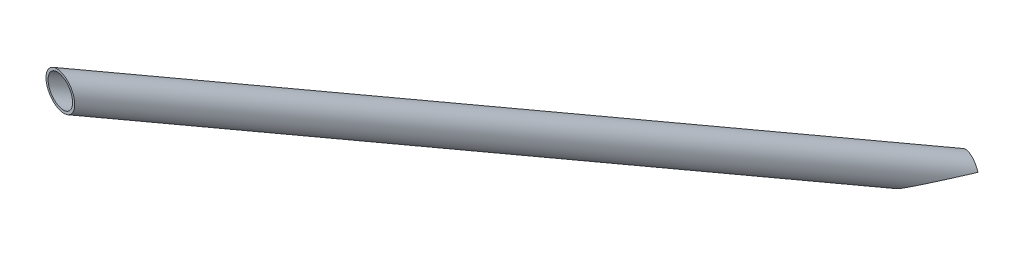
ISO-10303-21;
HEADER;
FILE_DESCRIPTION(('STEP AP214'),'2;1');
FILE_NAME('part.step','',(''),(''),'','','');
FILE_SCHEMA(('AUTOMOTIVE_DESIGN { 1 0 10303 214 1 1 1 1 }'));
ENDSEC;
DATA;
#1=APPLICATION_CONTEXT('core data for automotive mechanical design processes');
#2=APPLICATION_PROTOCOL_DEFINITION('international standard','automotive_design',2000,#1);
#3=PRODUCT_CONTEXT('',#1,'mechanical');
#4=PRODUCT('Part','Part','',(#3));
#5=PRODUCT_RELATED_PRODUCT_CATEGORY('part','',(#4));
#6=PRODUCT_DEFINITION_FORMATION('','',#4);
#7=PRODUCT_DEFINITION_CONTEXT('part definition',#1,'design');
#8=PRODUCT_DEFINITION('design','',#6,#7);
#9=PRODUCT_DEFINITION_SHAPE('','',#8);
#10=(LENGTH_UNIT() NAMED_UNIT(*) SI_UNIT(.MILLI.,.METRE.));
#11=(NAMED_UNIT(*) PLANE_ANGLE_UNIT() SI_UNIT($,.RADIAN.));
#12=(NAMED_UNIT(*) SI_UNIT($,.STERADIAN.) SOLID_ANGLE_UNIT());
#13=UNCERTAINTY_MEASURE_WITH_UNIT(LENGTH_MEASURE(1.E-05),#10,'distance_accuracy_value','');
#14=(GEOMETRIC_REPRESENTATION_CONTEXT(3) GLOBAL_UNCERTAINTY_ASSIGNED_CONTEXT((#13)) GLOBAL_UNIT_ASSIGNED_CONTEXT((#10,
#11,#12)) REPRESENTATION_CONTEXT('',''));
#15=CARTESIAN_POINT('',(0.,0.,0.));
#16=DIRECTION('',(0.,0.,1.));
#17=DIRECTION('',(1.,0.,0.));
#18=AXIS2_PLACEMENT_3D('',#15,#16,#17);
#19=CARTESIAN_POINT('',(325.,320.,-1580.));
#20=DIRECTION('',(-0.345452680982297,0.355322757581791,0.86856674075549));
#21=DIRECTION('',(0.,-0.925546956205677,0.378632845720504));
#22=AXIS2_PLACEMENT_3D('',#19,#20,#21);
#23=CYLINDRICAL_SURFACE('',#22,9.39999999999998);
#24=CARTESIAN_POINT('',(150.,500.,-1140.));
#25=DIRECTION('',(-0.136924020573454,-0.023039322625737,0.990313587810925));
#26=DIRECTION('',(-0.508281006832033,0.859722512143853,-0.050275443378224));
#27=AXIS2_PLACEMENT_3D('',#24,#25,#26);
#28=ELLIPSE('',#27,10.4529482704683,9.39999999999998);
#29=CARTESIAN_POINT('',(144.686964928723,508.986634946397,-1140.52552660891));
#30=VERTEX_POINT('',#29);
#31=EDGE_CURVE('E165',#30,#30,#28,.T.);
#32=ORIENTED_EDGE('',*,*,#31,.T.);
#33=EDGE_LOOP('',(#32));
#34=FACE_BOUND('',#33,.T.);
#35=CARTESIAN_POINT('',(313.391379029557,323.24015446698,-1547.25346138168));
#36=CARTESIAN_POINT('',(313.306462659418,323.127909911713,-1547.527826534));
#37=CARTESIAN_POINT('',(313.229987963669,323.019612485933,-1547.80644587069));
#38=CARTESIAN_POINT('',(313.090635670213,322.809730598405,-1548.36959867634));
#39=CARTESIAN_POINT('',(313.027764545925,322.708149348523,-1548.65413489065));
#40=CARTESIAN_POINT('',(312.913182050752,322.510663005139,-1549.22794091731));
#41=CARTESIAN_POINT('',(312.861490271547,322.414768086879,-1549.5172180992));
#42=CARTESIAN_POINT('',(312.767623797387,322.228166066819,-1550.09889240719));
#43=CARTESIAN_POINT('',(312.725447568451,322.137458130601,-1550.39128902244));
#44=CARTESIAN_POINT('',(312.648807949562,321.959692911334,-1550.98177545602));
#45=CARTESIAN_POINT('',(312.614435307557,321.872687286649,-1551.27989244835));
#46=CARTESIAN_POINT('',(312.552897261777,321.70297769777,-1551.87808761153));
#47=CARTESIAN_POINT('',(312.525732090417,321.620273872362,-1552.17816584531));
#48=CARTESIAN_POINT('',(312.477757729261,321.458946752324,-1552.7794809905));
#49=CARTESIAN_POINT('',(312.456940045281,321.380318122352,-1553.08071580235));
#50=CARTESIAN_POINT('',(312.420894937459,321.226769107881,-1553.68445596481));
#51=CARTESIAN_POINT('',(312.405667508153,321.151848719758,-1553.98696131419));
#52=CARTESIAN_POINT('',(312.377759968687,320.991459217465,-1554.6512815722));
#53=CARTESIAN_POINT('',(312.366132215351,320.906730799153,-1555.01331929395));
#54=CARTESIAN_POINT('',(312.349139971274,320.742042222231,-1555.73863338675));
#55=CARTESIAN_POINT('',(312.34377574797,320.662082267359,-1556.10190981003));
#56=CARTESIAN_POINT('',(312.338618706706,320.506786717069,-1556.82956184642));
#57=CARTESIAN_POINT('',(312.338827003523,320.431452049955,-1557.19393766488));
#58=CARTESIAN_POINT('',(312.344228277945,320.285374935424,-1557.92357810881));
#59=CARTESIAN_POINT('',(312.349421374773,320.214632597885,-1558.28884275532));
#60=CARTESIAN_POINT('',(312.364307216126,320.077532084427,-1559.02145297311));
#61=CARTESIAN_POINT('',(312.374015980393,320.011190485876,-1559.3888013154));
#62=CARTESIAN_POINT('',(312.397479370132,319.88329073888,-1560.12420108181));
#63=CARTESIAN_POINT('',(312.411234008086,319.821732605195,-1560.4922525081));
#64=CARTESIAN_POINT('',(312.442367798069,319.70363242758,-1561.22891126357));
#65=CARTESIAN_POINT('',(312.459746040001,319.647089129209,-1561.59751843015));
#66=CARTESIAN_POINT('',(312.497739952353,319.539330973045,-1562.33533867598));
#67=CARTESIAN_POINT('',(312.518355567808,319.488116024813,-1562.70455174486));
#68=CARTESIAN_POINT('',(312.562180360965,319.392073840806,-1563.43901056499));
#69=CARTESIAN_POINT('',(312.585354431311,319.347175639673,-1563.80424911122));
#70=CARTESIAN_POINT('',(312.634144261338,319.263642019158,-1564.53527170687));
#71=CARTESIAN_POINT('',(312.659759952212,319.225006423379,-1564.90105574064));
#72=CARTESIAN_POINT('',(312.713100229066,319.154789400586,-1565.63346831651));
#73=CARTESIAN_POINT('',(312.740826593697,319.123214013384,-1566.00009731266));
#74=CARTESIAN_POINT('',(312.797999874521,319.068267573599,-1566.73383304211));
#75=CARTESIAN_POINT('',(312.827446736001,319.044896260279,-1567.10093975986));
#76=CARTESIAN_POINT('',(312.887513851688,319.007948367244,-1567.83356460011));
#77=CARTESIAN_POINT('',(312.91812691934,318.994319631457,-1568.19908060962));
#78=CARTESIAN_POINT('',(312.980282531719,318.978638978479,-1568.93036543657));
#79=CARTESIAN_POINT('',(313.01182521751,318.976588827473,-1569.29613428407));
#80=CARTESIAN_POINT('',(313.075383797174,318.986774423526,-1570.02689775773));
#81=CARTESIAN_POINT('',(313.107398896324,318.998988396284,-1570.3918927141));
#82=CARTESIAN_POINT('',(313.171567319548,319.041344699291,-1571.12078479107));
#83=CARTESIAN_POINT('',(313.203720576669,319.071479145402,-1571.48468232375));
#84=CARTESIAN_POINT('',(313.246404668895,319.126795695143,-1571.96664169573));
#85=CARTESIAN_POINT('',(313.256974440496,319.141744609315,-1572.08589662163));
#86=CARTESIAN_POINT('',(313.278107762312,319.174362877854,-1572.32404025375));
#87=CARTESIAN_POINT('',(313.288671312188,319.192032368911,-1572.44292894127));
#88=CARTESIAN_POINT('',(313.320361179286,319.249475830374,-1572.79895636258));
#89=CARTESIAN_POINT('',(313.341482381472,319.293679360767,-1573.03540743625));
#90=CARTESIAN_POINT('',(313.383800590528,319.395910330689,-1573.50493406612));
#91=CARTESIAN_POINT('',(313.404997422977,319.453915630015,-1573.73801440071));
#92=CARTESIAN_POINT('',(313.447815842203,319.586101160119,-1574.1995405123));
#93=CARTESIAN_POINT('',(313.469437348357,319.660278347209,-1574.42798715257));
#94=CARTESIAN_POINT('',(313.510023347026,319.813177457984,-1574.84046112204));
#95=CARTESIAN_POINT('',(313.528829845703,319.889079955563,-1575.02554431138));
#96=CARTESIAN_POINT('',(313.567718068426,320.054795179338,-1575.38926212013));
#97=CARTESIAN_POINT('',(313.587799642305,320.144606269296,-1575.56789749503));
#98=CARTESIAN_POINT('',(313.629980563291,320.338709515816,-1575.91669464057));
#99=CARTESIAN_POINT('',(313.652078030965,320.442988230419,-1576.08686407985));
#100=CARTESIAN_POINT('',(313.699263860153,320.666068399145,-1576.41698817946));
#101=CARTESIAN_POINT('',(313.724352148057,320.784869495853,-1576.57694309103));
#102=CARTESIAN_POINT('',(313.778752581641,321.036815579896,-1576.88573322604));
#103=CARTESIAN_POINT('',(313.808085335712,321.170029701768,-1577.0345084796));
#104=CARTESIAN_POINT('',(313.872034947655,321.448736864323,-1577.31883470069));
#105=CARTESIAN_POINT('',(313.906652040501,321.594230450898,-1577.45438507972));
#106=CARTESIAN_POINT('',(313.982298772631,321.895557348825,-1577.71181223139));
#107=CARTESIAN_POINT('',(314.023335423304,322.051401856996,-1577.83367380021));
#108=CARTESIAN_POINT('',(314.112739183954,322.370961886856,-1578.06357229669));
#109=CARTESIAN_POINT('',(314.161106473173,322.534677600938,-1578.17160888622));
#110=CARTESIAN_POINT('',(314.26275434903,322.857602927254,-1578.36819555231));
#111=CARTESIAN_POINT('',(314.315561739577,323.016487473446,-1578.45752846832));
#112=CARTESIAN_POINT('',(314.428775947887,323.337383576404,-1578.62500391813));
#113=CARTESIAN_POINT('',(314.489182252349,323.499394921331,-1578.70314720702));
#114=CARTESIAN_POINT('',(314.617930183799,323.824971175952,-1578.84895106383));
#115=CARTESIAN_POINT('',(314.68627224014,323.988536169264,-1578.91661106411));
#116=CARTESIAN_POINT('',(314.831099882062,324.315820699782,-1579.04215996944));
#117=CARTESIAN_POINT('',(314.90758650695,324.479540254061,-1579.10004762504));
#118=CARTESIAN_POINT('',(315.084943747195,324.838552746723,-1579.21739879305));
#119=CARTESIAN_POINT('',(315.187630824995,325.033606830367,-1579.27485894956));
#120=CARTESIAN_POINT('',(315.404879661446,325.420255063384,-1579.37771371633));
#121=CARTESIAN_POINT('',(315.519442562681,325.611848877757,-1579.42310716413));
#122=CARTESIAN_POINT('',(315.760330830834,325.990023804921,-1579.50274404864));
#123=CARTESIAN_POINT('',(315.88666192428,326.176602419761,-1579.53698202014));
#124=CARTESIAN_POINT('',(316.150726497672,326.543195915261,-1579.59503608644));
#125=CARTESIAN_POINT('',(316.28846045803,326.723210518914,-1579.61885174187));
#126=CARTESIAN_POINT('',(316.593118556831,327.097778391297,-1579.65910030134));
#127=CARTESIAN_POINT('',(316.761527444665,327.291269826378,-1579.67420941199));
#128=CARTESIAN_POINT('',(317.111481636771,327.666597760429,-1579.69272972553));
#129=CARTESIAN_POINT('',(317.293028024381,327.848433295899,-1579.69613996258));
#130=CARTESIAN_POINT('',(317.668310537532,328.198997144953,-1579.69185317941));
#131=CARTESIAN_POINT('',(317.862049084144,328.367722840275,-1579.68415394641));
#132=CARTESIAN_POINT('',(318.260544000781,328.690717449159,-1579.6581152711));
#133=CARTESIAN_POINT('',(318.465300323833,328.844986424346,-1579.63977587416));
#134=CARTESIAN_POINT('',(318.890390867446,329.142012179046,-1579.5921679212));
#135=CARTESIAN_POINT('',(319.11099995194,329.284329491712,-1579.56260960806));
#136=CARTESIAN_POINT('',(319.560981429077,329.551454819199,-1579.49292604648));
#137=CARTESIAN_POINT('',(319.790354043925,329.676262389673,-1579.45280052994));
#138=CARTESIAN_POINT('',(320.256179858524,329.907516565399,-1579.36216698915));
#139=CARTESIAN_POINT('',(320.492632701499,330.013964094,-1579.3116594873));
#140=CARTESIAN_POINT('',(320.970835960314,330.207868208567,-1579.20033006992));
#141=CARTESIAN_POINT('',(321.212586345592,330.295324904057,-1579.13950821388));
#142=CARTESIAN_POINT('',(321.699732017285,330.450910321587,-1579.00742144844));
#143=CARTESIAN_POINT('',(321.945130883907,330.519018530935,-1578.93614557645));
#144=CARTESIAN_POINT('',(322.437286304744,330.635593227328,-1578.78298850079));
#145=CARTESIAN_POINT('',(322.684042875581,330.684059473362,-1578.701107167));
#146=CARTESIAN_POINT('',(323.176902423289,330.761433289443,-1578.52629136005));
#147=CARTESIAN_POINT('',(323.423004845197,330.790327608276,-1578.43334944825));
#148=CARTESIAN_POINT('',(323.912041590873,330.828840843335,-1578.23585283609));
#149=CARTESIAN_POINT('',(324.154975980989,330.838460163885,-1578.13129837935));
#150=CARTESIAN_POINT('',(324.633645393211,330.839084231233,-1577.91040592809));
#151=CARTESIAN_POINT('',(324.869415626349,330.830203636315,-1577.79414474024));
#152=CARTESIAN_POINT('',(325.332568977065,330.795092642205,-1577.54818846958));
#153=CARTESIAN_POINT('',(325.559951212002,330.768860422628,-1577.41849197845));
#154=CARTESIAN_POINT('',(326.002847544136,330.700627148027,-1577.14454894598));
#155=CARTESIAN_POINT('',(326.218379142943,330.658650104351,-1577.00032480349));
#156=CARTESIAN_POINT('',(326.634402233485,330.561074913088,-1576.69573064436));
#157=CARTESIAN_POINT('',(326.834899965235,330.505482458101,-1576.53536739195));
#158=CARTESIAN_POINT('',(327.165072493667,330.400201553315,-1576.24322134777));
#159=CARTESIAN_POINT('',(327.299180344012,330.353018359028,-1576.11552463007));
#160=CARTESIAN_POINT('',(327.555910915959,330.254409715284,-1575.85060054763));
#161=CARTESIAN_POINT('',(327.678536569955,330.202985355306,-1575.71337563193));
#162=CARTESIAN_POINT('',(327.910736496089,330.097569724206,-1575.42959383175));
#163=CARTESIAN_POINT('',(328.020331467396,330.043582720037,-1575.28305233076));
#164=CARTESIAN_POINT('',(328.225573709543,329.93466930236,-1574.98081992135));
#165=CARTESIAN_POINT('',(328.321220861124,329.879742880823,-1574.82512893472));
#166=CARTESIAN_POINT('',(328.497974447182,329.770565640172,-1574.50524840975));
#167=CARTESIAN_POINT('',(328.579065689587,329.716315581285,-1574.34105022003));
#168=CARTESIAN_POINT('',(328.72647615569,329.610019652198,-1574.00548791009));
#169=CARTESIAN_POINT('',(328.792795510957,329.55797376237,-1573.83412385371));
#170=CARTESIAN_POINT('',(328.91118765808,329.457171065246,-1573.4854805238));
#171=CARTESIAN_POINT('',(328.96324997026,329.408416697119,-1573.30819700597));
#172=CARTESIAN_POINT('',(329.054039960964,329.314934145395,-1572.94918688919));
#173=CARTESIAN_POINT('',(329.092762993491,329.270207368582,-1572.76745876577));
#174=CARTESIAN_POINT('',(329.176063570759,329.161773903307,-1572.30015768637));
#175=CARTESIAN_POINT('',(329.212180129676,329.101131186776,-1572.01235727201));
#176=CARTESIAN_POINT('',(329.260514450112,328.990226917209,-1571.43279010332));
#177=CARTESIAN_POINT('',(329.272715432673,328.93997267473,-1571.14102070879));
#178=CARTESIAN_POINT('',(329.277936157741,328.848581293531,-1570.55481192572));
#179=CARTESIAN_POINT('',(329.27088166865,328.80748010064,-1570.26036657804));
#180=CARTESIAN_POINT('',(329.248706866142,328.751808839188,-1569.81866401291));
#181=CARTESIAN_POINT('',(329.239384810821,328.734250168064,-1569.67144085698));
#182=CARTESIAN_POINT('',(329.217266961981,328.700943689838,-1569.37704714029));
#183=CARTESIAN_POINT('',(329.204471152958,328.685195890819,-1569.22987657977));
#184=CARTESIAN_POINT('',(329.165655990245,328.6448270583,-1568.83206734367));
#185=CARTESIAN_POINT('',(329.136670521946,328.621768159332,-1568.58155864257));
#186=CARTESIAN_POINT('',(329.071095954251,328.579639363191,-1568.08118678242));
#187=CARTESIAN_POINT('',(329.034505695395,328.560570075183,-1567.8313237277));
#188=CARTESIAN_POINT('',(328.954825507513,328.525737046106,-1567.33227682758));
#189=CARTESIAN_POINT('',(328.91173214039,328.50997506416,-1567.08309341286));
#190=CARTESIAN_POINT('',(328.81993170399,328.481188489412,-1566.58559834725));
#191=CARTESIAN_POINT('',(328.77122427735,328.468164071019,-1566.33728675289));
#192=CARTESIAN_POINT('',(328.617515032418,328.432372558916,-1565.59255658703));
#193=CARTESIAN_POINT('',(328.50511757338,328.412962942494,-1565.09749793663));
#194=CARTESIAN_POINT('',(328.264598537811,328.379882895258,-1564.11123747792));
#195=CARTESIAN_POINT('',(328.136481334241,328.366210873002,-1563.62003463725));
#196=CARTESIAN_POINT('',(327.865834710533,328.34215613266,-1562.63757028523));
#197=CARTESIAN_POINT('',(327.723204146296,328.331798925907,-1562.14633611586));
#198=CARTESIAN_POINT('',(327.425821493526,328.312650455157,-1561.1674992334));
#199=CARTESIAN_POINT('',(327.271068641191,328.303859289948,-1560.67989675127));
#200=CARTESIAN_POINT('',(326.950567055153,328.286356827678,-1559.70927092897));
#201=CARTESIAN_POINT('',(326.784838103999,328.27764541749,-1559.22624105221));
#202=CARTESIAN_POINT('',(326.442517974681,328.259008737883,-1558.26408437101));
#203=CARTESIAN_POINT('',(326.26592709731,328.249083502071,-1557.7849574589));
#204=CARTESIAN_POINT('',(325.902871258431,328.226913729318,-1556.83350321162));
#205=CARTESIAN_POINT('',(325.716465419149,328.214682140389,-1556.36115304157));
#206=CARTESIAN_POINT('',(325.332571070064,328.186740912815,-1555.42105750556));
#207=CARTESIAN_POINT('',(325.135082180951,328.171031155077,-1554.95331229785));
#208=CARTESIAN_POINT('',(324.727930492944,328.134914940583,-1554.02210980413));
#209=CARTESIAN_POINT('',(324.518242457584,328.114498468576,-1553.55866388566));
#210=CARTESIAN_POINT('',(324.194102467079,328.079354206564,-1552.86828220147));
#211=CARTESIAN_POINT('',(324.08446098208,328.066887030147,-1552.63896573018));
#212=CARTESIAN_POINT('',(323.861774120323,328.040246863925,-1552.18205844897));
#213=CARTESIAN_POINT('',(323.748728351458,328.026073677055,-1551.95446784165));
#214=CARTESIAN_POINT('',(323.405903679407,327.980907205813,-1551.27796559878));
#215=CARTESIAN_POINT('',(323.170836802951,327.947098807194,-1550.83189755523));
#216=CARTESIAN_POINT('',(322.68446505947,327.86991781889,-1549.9495485525));
#217=CARTESIAN_POINT('',(322.433162969871,327.826546862065,-1549.51326593638));
#218=CARTESIAN_POINT('',(322.042097564962,327.752260225152,-1548.86937338494));
#219=CARTESIAN_POINT('',(321.909596683529,327.726005252731,-1548.65680434387));
#220=CARTESIAN_POINT('',(321.639266220005,327.669936761335,-1548.23556868376));
#221=CARTESIAN_POINT('',(321.501437102249,327.640123551977,-1548.02690172702));
#222=CARTESIAN_POINT('',(321.21993577573,327.57639648963,-1547.61440561685));
#223=CARTESIAN_POINT('',(321.076267997111,327.542485708538,-1547.41057297466));
#224=CARTESIAN_POINT('',(320.782259534221,327.469841476353,-1547.00868416325));
#225=CARTESIAN_POINT('',(320.631920268162,327.431109047105,-1546.81062678102));
#226=CARTESIAN_POINT('',(320.399933962129,327.368501902156,-1546.51801720344));
#227=CARTESIAN_POINT('',(320.32111935827,327.346762506948,-1546.42075688236));
#228=CARTESIAN_POINT('',(320.16140511976,327.30167457143,-1546.22834716404));
#229=CARTESIAN_POINT('',(320.080505488986,327.278326034113,-1546.13319776287));
#230=CARTESIAN_POINT('',(319.834332622988,327.205596183749,-1545.85120540271));
#231=CARTESIAN_POINT('',(319.665680081357,327.153555900861,-1545.66793883856));
#232=CARTESIAN_POINT('',(319.319077892299,327.041155372274,-1545.31530246733));
#233=CARTESIAN_POINT('',(319.141190778369,326.980847456269,-1545.14585517661));
#234=CARTESIAN_POINT('',(318.773859797382,326.849685681518,-1544.82467486529));
#235=CARTESIAN_POINT('',(318.584433381046,326.778847524772,-1544.67291605987));
#236=CARTESIAN_POINT('',(318.236100766206,326.641193613357,-1544.42545698244));
#237=CARTESIAN_POINT('',(318.079742753641,326.576969920328,-1544.3247884634));
#238=CARTESIAN_POINT('',(317.758986226535,326.439167086038,-1544.14394187452));
#239=CARTESIAN_POINT('',(317.594580577788,326.365579547833,-1544.06378239265));
#240=CARTESIAN_POINT('',(317.25702857427,326.207113368714,-1543.93028652016));
#241=CARTESIAN_POINT('',(317.08379609404,326.122099788998,-1543.87731419893));
#242=CARTESIAN_POINT('',(316.735263165208,325.942113474573,-1543.80824129564));
#243=CARTESIAN_POINT('',(316.559969598876,325.847168373761,-1543.79204110914));
#244=CARTESIAN_POINT('',(316.231182115542,325.659596110271,-1543.80135237231));
#245=CARTESIAN_POINT('',(316.077213358978,325.567624683067,-1543.82300094738));
#246=CARTESIAN_POINT('',(315.779443107841,325.381344479424,-1543.9000496223));
#247=CARTESIAN_POINT('',(315.63564916768,325.287034035079,-1543.95547451229));
#248=CARTESIAN_POINT('',(315.348363782648,325.090039663684,-1544.10212281228));
#249=CARTESIAN_POINT('',(315.206384697676,324.987477531237,-1544.19640898363));
#250=CARTESIAN_POINT('',(314.940500047475,324.786336188895,-1544.41112484369));
#251=CARTESIAN_POINT('',(314.816633055157,324.687765793639,-1544.53160900749));
#252=CARTESIAN_POINT('',(314.606276226057,324.51286898364,-1544.76790010726));
#253=CARTESIAN_POINT('',(314.517056353672,324.435703362845,-1544.88073075088));
#254=CARTESIAN_POINT('',(314.348607316251,324.284806711762,-1545.11584596896));
#255=CARTESIAN_POINT('',(314.269385650803,324.211078285525,-1545.2381375304));
#256=CARTESIAN_POINT('',(314.119610045233,324.066844122919,-1545.48999199178));
#257=CARTESIAN_POINT('',(314.049070417933,323.996343825316,-1545.61956639902));
#258=CARTESIAN_POINT('',(313.915662918646,323.858464680084,-1545.88410380093));
#259=CARTESIAN_POINT('',(313.85279273552,323.791084895923,-1546.01906515592));
#260=CARTESIAN_POINT('',(313.716229102216,323.639809615448,-1546.33340291551));
#261=CARTESIAN_POINT('',(313.644765027821,323.556862372393,-1546.51420229965));
#262=CARTESIAN_POINT('',(313.544672265963,323.435706056341,-1546.78904299669));
#263=CARTESIAN_POINT('',(313.512528025028,323.395912898574,-1546.88114493068));
#264=CARTESIAN_POINT('',(313.450387108925,323.317311086124,-1547.06648619501));
#265=CARTESIAN_POINT('',(313.420390403512,323.278502417581,-1547.15972550931));
#266=CARTESIAN_POINT('',(313.391379029557,323.24015446698,-1547.25346138168));
#267=B_SPLINE_CURVE_WITH_KNOTS('',3,(#35,#36,#37,#38,#39,#40,#41,#42,#43,#44,#45,#46,#47,#48,
#49,#50,#51,#52,#53,#54,#55,#56,#57,#58,#59,#60,#61,#62,#63,#64,#65,#66,#67,#68,#69,#70,#71,#72,
#73,#74,#75,#76,#77,#78,#79,#80,#81,#82,#83,#84,#85,#86,#87,#88,#89,#90,#91,#92,#93,#94,#95,#96,
#97,#98,#99,#100,#101,#102,#103,#104,#105,#106,#107,#108,#109,#110,#111,#112,#113,#114,#115,
#116,#117,#118,#119,#120,#121,#122,#123,#124,#125,#126,#127,#128,#129,#130,#131,#132,#133,#134,
#135,#136,#137,#138,#139,#140,#141,#142,#143,#144,#145,#146,#147,#148,#149,#150,#151,#152,#153,
#154,#155,#156,#157,#158,#159,#160,#161,#162,#163,#164,#165,#166,#167,#168,#169,#170,#171,#172,
#173,#174,#175,#176,#177,#178,#179,#180,#181,#182,#183,#184,#185,#186,#187,#188,#189,#190,#191,
#192,#193,#194,#195,#196,#197,#198,#199,#200,#201,#202,#203,#204,#205,#206,#207,#208,#209,#210,
#211,#212,#213,#214,#215,#216,#217,#218,#219,#220,#221,#222,#223,#224,#225,#226,#227,#228,#229,
#230,#231,#232,#233,#234,#235,#236,#237,#238,#239,#240,#241,#242,#243,#244,#245,#246,#247,#248,
#249,#250,#251,#252,#253,#254,#255,#256,#257,#258,#259,#260,#261,#262,#263,#264,#265,#266),
.UNSPECIFIED.,.T.,.F.,(4,2,2,2,2,2,2,2,2,2,2,2,2,2,2,2,2,2,2,2,2,2,2,2,2,2,2,2,2,2,2,2,2,2,2,2,
2,2,2,2,2,2,2,2,2,2,2,2,2,2,2,2,2,2,2,2,2,2,2,2,2,2,2,2,2,2,2,2,2,2,2,2,2,2,2,2,2,2,2,2,2,2,2,2,
2,2,2,2,2,2,2,2,2,2,2,2,2,2,2,2,2,2,2,2,2,2,2,2,2,2,2,2,2,2,2,4),(0.,0.925033874373766,
1.85050697365293,2.77758904273771,3.70452155206488,4.64173646406392,5.5789815942764,
6.51496694578857,7.45095138250212,8.56685966376785,9.68281558973965,10.7989947632387,
11.9152006335233,13.0353969079642,14.1555966386534,15.27551536082,16.3954150712436,
17.501508381421,18.6075705311016,19.7145752964418,20.8215448765878,21.9225430832217,
23.0237092304382,24.1231966333121,25.2222006726362,25.5841308423357,25.9460792023469,
26.6701242990382,27.3930156526482,28.1157710691942,28.7180303990041,29.3202189314703,
29.921851667709,30.5234695999715,31.1281132376922,31.7327837694623,32.3381193886909,
32.9434698113292,33.5122581199155,34.0810080277361,34.6497887211975,35.218642082486,
35.9013457246459,36.5841151113725,37.267218493944,37.9503506707784,38.720345438551,
39.4904037736635,40.2606155094542,41.0308239618468,41.8224519749877,42.6141000737245,
43.4057083478495,44.197312056449,44.989751894307,45.7822014552264,46.5751870109406,
47.3681559322685,48.1562248371437,48.9443764326647,49.7313309273328,50.5179569564667,
51.0906791273579,51.6632546317147,52.2349080948376,52.8065664454812,53.378818012723,
53.9510644828498,54.5237304619918,55.0965956963158,55.9840256920248,56.8720780782467,
57.7635588176037,58.2091975671908,58.6548383057682,59.414345126761,60.1739678306046,
60.9339935518726,61.6940676792503,63.2177331098105,64.7409756398746,66.2756740895087,
67.8104693154661,69.3425698938997,70.8746280639288,72.3983283014142,73.9220807183905,
75.4491059001499,76.2125317577847,76.9760458858734,78.4917246870061,80.0071448777284,
80.7626240318391,81.5180374965736,82.2728881105264,83.0275790213673,83.4087147940046,
83.7898498579582,84.5525854005469,85.3106987988972,86.0676928823091,86.656804180432,
87.2464475316645,87.8437934097121,88.4395193202601,88.9779342549035,89.5167448362704,
90.1102493593639,90.7050000000846,91.1940186747648,91.6834020061508,92.1735816039134,
92.6636131222869,93.2972850798415,93.6133240442457,93.9293585568733),.UNSPECIFIED.);
#268=CARTESIAN_POINT('',(326.097017043236,330.68011117536,-1577.07850588415));
#269=VERTEX_POINT('',#268);
#270=CARTESIAN_POINT('',(312.477687822449,319.596210226998,-1561.94590544936));
#271=VERTEX_POINT('',#270);
#272=EDGE_CURVE('E151',#269,#271,#267,.T.);
#273=ORIENTED_EDGE('',*,*,#272,.T.);
#274=CARTESIAN_POINT('',(316.194025613644,320.357432266204,-1554.30011565025));
#275=CARTESIAN_POINT('',(316.076211359609,320.33370518125,-1554.35811935534));
#276=CARTESIAN_POINT('',(315.961289546351,320.310468056382,-1554.42231252039));
#277=CARTESIAN_POINT('',(315.738113163217,320.26516923388,-1554.56179894691));
#278=CARTESIAN_POINT('',(315.629864274406,320.243108539912,-1554.63710148635));
#279=CARTESIAN_POINT('',(315.315177942057,320.178735500045,-1554.87810597089));
#280=CARTESIAN_POINT('',(315.119467975233,320.138366803949,-1555.0585646477));
#281=CARTESIAN_POINT('',(314.814234459262,320.075000279802,-1555.38580660082));
#282=CARTESIAN_POINT('',(314.696942706711,320.050527780766,-1555.52537554563));
#283=CARTESIAN_POINT('',(314.474973363817,320.004035758788,-1555.81461626779));
#284=CARTESIAN_POINT('',(314.370296661008,319.982016408445,-1555.96428875483));
#285=CARTESIAN_POINT('',(314.172416013965,319.940264999076,-1556.27152867295));
#286=CARTESIAN_POINT('',(314.079226877257,319.920535894055,-1556.42910593292));
#287=CARTESIAN_POINT('',(313.903326196989,319.883222924768,-1556.75017416908));
#288=CARTESIAN_POINT('',(313.820613400495,319.865638803978,-1556.91366443507));
#289=CARTESIAN_POINT('',(313.596362096904,319.817937494572,-1557.39003722806));
#290=CARTESIAN_POINT('',(313.466534772453,319.790286293813,-1557.7086936823));
#291=CARTESIAN_POINT('',(313.233556326958,319.740940125263,-1558.35609600451));
#292=CARTESIAN_POINT('',(313.130430045968,319.719250702583,-1558.68485095141));
#293=CARTESIAN_POINT('',(312.9460218565,319.681101464095,-1559.34966180373));
#294=CARTESIAN_POINT('',(312.864803084871,319.66465673904,-1559.68573585691));
#295=CARTESIAN_POINT('',(312.721046898759,319.636605914155,-1560.36186094753));
#296=CARTESIAN_POINT('',(312.658503215541,319.624998190153,-1560.70191061056));
#297=CARTESIAN_POINT('',(312.542268348745,319.605102355333,-1561.42868170435));
#298=CARTESIAN_POINT('',(312.490759779619,319.597435601496,-1561.81576526896));
#299=CARTESIAN_POINT('',(312.404987732425,319.587659515298,-1562.59195462883));
#300=CARTESIAN_POINT('',(312.370728445284,319.585551532983,-1562.98106089236));
#301=CARTESIAN_POINT('',(312.317155652781,319.586902064772,-1563.76071872765));
#302=CARTESIAN_POINT('',(312.297859431888,319.590367002237,-1564.1512714488));
#303=CARTESIAN_POINT('',(312.272496182461,319.603083129182,-1564.93266093964));
#304=CARTESIAN_POINT('',(312.266427995795,319.612333812022,-1565.32349768146));
#305=CARTESIAN_POINT('',(312.266115470561,319.637048358431,-1566.1049791242));
#306=CARTESIAN_POINT('',(312.271871409868,319.652512368011,-1566.49562382039));
#307=CARTESIAN_POINT('',(312.294096145712,319.690338282366,-1567.27629073955));
#308=CARTESIAN_POINT('',(312.310565500299,319.712700546432,-1567.66631292903));
#309=CARTESIAN_POINT('',(312.353318914545,319.765310494247,-1568.44495162318));
#310=CARTESIAN_POINT('',(312.37959458661,319.79555143251,-1568.83356904339));
#311=CARTESIAN_POINT('',(312.441277744498,319.865362531341,-1569.60920797925));
#312=CARTESIAN_POINT('',(312.476684218441,319.904931658115,-1569.99622966692));
#313=CARTESIAN_POINT('',(312.551005807707,319.989608990323,-1570.71819320846));
#314=CARTESIAN_POINT('',(312.58887648455,320.03334091593,-1571.05340300537));
#315=CARTESIAN_POINT('',(312.670980070602,320.131334926816,-1571.72156041066));
#316=CARTESIAN_POINT('',(312.71521364661,320.185598115927,-1572.05450777813));
#317=CARTESIAN_POINT('',(312.809968176043,320.307190951418,-1572.7169780247));
#318=CARTESIAN_POINT('',(312.860486214888,320.374514548749,-1573.04650241503));
#319=CARTESIAN_POINT('',(312.967972115484,320.525726167705,-1573.70067646145));
#320=CARTESIAN_POINT('',(313.02493820241,320.609609635936,-1574.02532743121));
#321=CARTESIAN_POINT('',(313.127438534727,320.76994562769,-1574.56960283703));
#322=CARTESIAN_POINT('',(313.171188046917,320.840913556321,-1574.79117056187));
#323=CARTESIAN_POINT('',(313.262354331704,320.995176956871,-1575.22929154736));
#324=CARTESIAN_POINT('',(313.309771492922,321.078473736002,-1575.44584427345));
#325=CARTESIAN_POINT('',(313.408594324659,321.25939701729,-1575.87143170895));
#326=CARTESIAN_POINT('',(313.45999112082,321.356992045689,-1576.08048170646));
#327=CARTESIAN_POINT('',(313.567457742038,321.568854676379,-1576.48871960736));
#328=CARTESIAN_POINT('',(313.623525359853,321.683114422546,-1576.68791209887));
#329=CARTESIAN_POINT('',(313.725103881428,321.896380839628,-1577.02041614862));
#330=CARTESIAN_POINT('',(313.769330074282,321.99106407078,-1577.156893146));
#331=CARTESIAN_POINT('',(313.86102946139,322.190433995081,-1577.42115232388));
#332=CARTESIAN_POINT('',(313.908501608219,322.295117465581,-1577.54893728288));
#333=CARTESIAN_POINT('',(314.007016398707,322.51417958516,-1577.79413366949));
#334=CARTESIAN_POINT('',(314.058054416055,322.628545711464,-1577.91155810681));
#335=CARTESIAN_POINT('',(314.16413161124,322.866333460281,-1578.13488281487));
#336=CARTESIAN_POINT('',(314.21917081174,322.989755134086,-1578.24078302033));
#337=CARTESIAN_POINT('',(314.333661711686,323.244503793325,-1578.44025175106));
#338=CARTESIAN_POINT('',(314.393117899078,323.375838792896,-1578.53380745808));
#339=CARTESIAN_POINT('',(314.516709405572,323.644653015553,-1578.70809795563));
#340=CARTESIAN_POINT('',(314.580844820402,323.782132364318,-1578.78883248376));
#341=CARTESIAN_POINT('',(314.714193915291,324.061710650353,-1578.93779381738));
#342=CARTESIAN_POINT('',(314.783417041989,324.203817893508,-1579.00599648864));
#343=CARTESIAN_POINT('',(314.927072031699,324.490679881938,-1579.13030788545));
#344=CARTESIAN_POINT('',(315.00150525955,324.635435313544,-1579.18641342621));
#345=CARTESIAN_POINT('',(315.17987048771,324.971400165799,-1579.30313397097));
#346=CARTESIAN_POINT('',(315.285752850294,325.162992424422,-1579.3596806799));
#347=CARTESIAN_POINT('',(315.507105244469,325.544949320976,-1579.45552883487));
#348=CARTESIAN_POINT('',(315.622578259568,325.73531355689,-1579.49482489041));
#349=CARTESIAN_POINT('',(315.863357576431,326.112509729724,-1579.55830980958));
#350=CARTESIAN_POINT('',(315.98867224854,326.299338488425,-1579.58248565336));
#351=CARTESIAN_POINT('',(316.249066264881,326.667301851318,-1579.61757484078));
#352=CARTESIAN_POINT('',(316.384144867506,326.848436886474,-1579.62848919057));
#353=CARTESIAN_POINT('',(316.667091651438,327.207336793786,-1579.638801767));
#354=CARTESIAN_POINT('',(316.815177163242,327.384937621434,-1579.63793900264));
#355=CARTESIAN_POINT('',(317.121232587434,327.731005011313,-1579.62552420833));
#356=CARTESIAN_POINT('',(317.279202555477,327.899471522103,-1579.61397211819));
#357=CARTESIAN_POINT('',(317.604624148339,328.225919143197,-1579.58140690141));
#358=CARTESIAN_POINT('',(317.772073175864,328.383903100232,-1579.56039635555));
#359=CARTESIAN_POINT('',(318.116006218398,328.688268789196,-1579.50994721961));
#360=CARTESIAN_POINT('',(318.292490619927,328.834650024093,-1579.48050826871));
#361=CARTESIAN_POINT('',(318.679708657678,329.134760884899,-1579.40934029864));
#362=CARTESIAN_POINT('',(318.891734763232,329.286555988354,-1579.3664566972));
#363=CARTESIAN_POINT('',(319.325718715034,329.572206054165,-1579.27196905054));
#364=CARTESIAN_POINT('',(319.5476774452,329.706059415609,-1579.22036422806));
#365=CARTESIAN_POINT('',(320.000304357044,329.954624237223,-1579.10940206045));
#366=CARTESIAN_POINT('',(320.230975092311,330.069330030777,-1579.05004242956));
#367=CARTESIAN_POINT('',(320.699504533429,330.278503313993,-1578.92445183415));
#368=CARTESIAN_POINT('',(320.937363028926,330.372971395266,-1578.85822107057));
#369=CARTESIAN_POINT('',(321.417516523236,330.540430777271,-1578.71998877246));
#370=CARTESIAN_POINT('',(321.659784698713,330.613523136465,-1578.64801650921));
#371=CARTESIAN_POINT('',(322.148164707194,330.738225425941,-1578.49869508892));
#372=CARTESIAN_POINT('',(322.39427655416,330.789835278171,-1578.42134591236));
#373=CARTESIAN_POINT('',(322.888513875486,330.871180557711,-1578.26186309156));
#374=CARTESIAN_POINT('',(323.136639043118,330.90091925609,-1578.17973016478));
#375=CARTESIAN_POINT('',(323.63308308015,330.938382205867,-1578.01115225031));
#376=CARTESIAN_POINT('',(323.881401947907,330.946106641994,-1577.92470729882));
#377=CARTESIAN_POINT('',(324.373316169469,330.939662380109,-1577.74895626986));
#378=CARTESIAN_POINT('',(324.616932176452,330.925759854317,-1577.65969801629));
#379=CARTESIAN_POINT('',(325.100664879625,330.876851181387,-1577.47756570076));
#380=CARTESIAN_POINT('',(325.34078159382,330.841845142868,-1577.38469165742));
#381=CARTESIAN_POINT('',(325.815734685062,330.751222348599,-1577.19538084344));
#382=CARTESIAN_POINT('',(326.050569632568,330.695600082484,-1577.09894312651));
#383=CARTESIAN_POINT('',(326.513043651436,330.564453387685,-1576.90242302901));
#384=CARTESIAN_POINT('',(326.740682710692,330.488928925517,-1576.8023406423));
#385=CARTESIAN_POINT('',(327.190336861479,330.317574081596,-1576.59663050717));
#386=CARTESIAN_POINT('',(327.412211627287,330.221449284822,-1576.49094114846));
#387=CARTESIAN_POINT('',(327.844646229675,330.010769859987,-1576.27482094141));
#388=CARTESIAN_POINT('',(328.055205066683,329.896213607377,-1576.16438967575));
#389=CARTESIAN_POINT('',(328.462892215279,329.650102141968,-1575.93780489678));
#390=CARTESIAN_POINT('',(328.660020377582,329.518546740269,-1575.8216513199));
#391=CARTESIAN_POINT('',(329.038547913085,329.240202725801,-1575.58222756));
#392=CARTESIAN_POINT('',(329.219951115557,329.093417840885,-1575.45895912181));
#393=CARTESIAN_POINT('',(329.525833081459,328.821265336171,-1575.23209736251));
#394=CARTESIAN_POINT('',(329.653951441073,328.698482405817,-1575.1302956249));
#395=CARTESIAN_POINT('',(329.897878570075,328.44643343464,-1574.92020286381));
#396=CARTESIAN_POINT('',(330.013690235013,328.317168929399,-1574.8119133762));
#397=CARTESIAN_POINT('',(330.231394893554,328.054010726952,-1574.58784079048));
#398=CARTESIAN_POINT('',(330.333311549466,327.920125398697,-1574.47207093944));
#399=CARTESIAN_POINT('',(330.521933038301,327.6495775546,-1574.23169632593));
#400=CARTESIAN_POINT('',(330.608641145036,327.512915643532,-1574.107093473));
#401=CARTESIAN_POINT('',(330.751674773926,327.263285571915,-1573.87078176672));
#402=CARTESIAN_POINT('',(330.810661815957,327.150360155209,-1573.76063736103));
#403=CARTESIAN_POINT('',(330.916656152938,326.925905970382,-1573.53337726353));
#404=CARTESIAN_POINT('',(330.963665118126,326.814377009603,-1573.41626254648));
#405=CARTESIAN_POINT('',(331.045273996871,326.594458864374,-1573.17519167321));
#406=CARTESIAN_POINT('',(331.079886444346,326.486066610989,-1573.05124257431));
#407=CARTESIAN_POINT('',(331.136756340975,326.27383219715,-1572.7967831138));
#408=CARTESIAN_POINT('',(331.159013585176,326.169990112202,-1572.66627264338));
#409=CARTESIAN_POINT('',(331.191551453355,325.968311811412,-1572.39970660344));
#410=CARTESIAN_POINT('',(331.201857105142,325.87046345288,-1572.26366324139));
#411=CARTESIAN_POINT('',(331.21136941875,325.681346398738,-1571.98672695832));
#412=CARTESIAN_POINT('',(331.210575869773,325.590077828128,-1571.84583394524));
#413=CARTESIAN_POINT('',(331.198937968804,325.414394716031,-1571.56009325207));
#414=CARTESIAN_POINT('',(331.188084432255,325.329986514523,-1571.41524207556));
#415=CARTESIAN_POINT('',(331.157475328384,325.168045359471,-1571.12264178362));
#416=CARTESIAN_POINT('',(331.137716575952,325.090514877752,-1570.97489164942));
#417=CARTESIAN_POINT('',(331.071905209179,324.883726058994,-1570.56055507174));
#418=CARTESIAN_POINT('',(331.017387442382,324.761633014272,-1570.29172207796));
#419=CARTESIAN_POINT('',(330.889392310656,324.535255367913,-1569.75107617976));
#420=CARTESIAN_POINT('',(330.815897742472,324.430987068442,-1569.47926078687));
#421=CARTESIAN_POINT('',(330.653816622571,324.236441745609,-1568.93365058792));
#422=CARTESIAN_POINT('',(330.565159936933,324.146233642889,-1568.65985251692));
#423=CARTESIAN_POINT('',(330.376025570822,323.97739339876,-1568.11296210437));
#424=CARTESIAN_POINT('',(330.275552031488,323.898757223663,-1567.83986954967));
#425=CARTESIAN_POINT('',(330.092538063026,323.770071522491,-1567.36682519011));
#426=CARTESIAN_POINT('',(330.012244776053,323.717947984533,-1567.16655497807));
#427=CARTESIAN_POINT('',(329.846876060663,323.617823092017,-1566.76695450195));
#428=CARTESIAN_POINT('',(329.761800372645,323.569821961592,-1566.56762428952));
#429=CARTESIAN_POINT('',(329.500011286227,323.430928705647,-1565.971162675));
#430=CARTESIAN_POINT('',(329.316783705782,323.345179073925,-1565.57568267739));
#431=CARTESIAN_POINT('',(328.934802088308,323.183097846395,-1564.7894569157));
#432=CARTESIAN_POINT('',(328.736019539265,323.106784239792,-1564.39872143714));
#433=CARTESIAN_POINT('',(328.324252984023,322.960847034961,-1563.62363428512));
#434=CARTESIAN_POINT('',(328.111271517447,322.891222245779,-1563.23928148533));
#435=CARTESIAN_POINT('',(327.670859727732,322.756329896654,-1562.47693630053));
#436=CARTESIAN_POINT('',(327.443396682122,322.691072941147,-1562.09896095099));
#437=CARTESIAN_POINT('',(326.974203939868,322.563426522584,-1561.35140743388));
#438=CARTESIAN_POINT('',(326.732472790869,322.501037352595,-1560.98183012646));
#439=CARTESIAN_POINT('',(326.234474149639,322.377896158765,-1560.25320848751));
#440=CARTESIAN_POINT('',(325.97823126294,322.317141606993,-1559.89414780555));
#441=CARTESIAN_POINT('',(325.449749285658,322.196035360366,-1559.18799313396));
#442=CARTESIAN_POINT('',(325.177513572184,322.135683583436,-1558.84089664232));
#443=CARTESIAN_POINT('',(324.618570688063,322.015020010193,-1558.16527132577));
#444=CARTESIAN_POINT('',(324.332064183374,321.954715621559,-1557.83657577769));
#445=CARTESIAN_POINT('',(323.739362251866,321.832418155223,-1557.19710099066));
#446=CARTESIAN_POINT('',(323.43315312684,321.7704239203,-1556.88633450787));
#447=CARTESIAN_POINT('',(322.958351610459,321.675652188861,-1556.43942012936));
#448=CARTESIAN_POINT('',(322.798115462972,321.643883962154,-1556.29414987808));
#449=CARTESIAN_POINT('',(322.471754844477,321.579544786298,-1556.01058787615));
#450=CARTESIAN_POINT('',(322.305631346871,321.546973970115,-1555.87229498097));
#451=CARTESIAN_POINT('',(321.967254866864,321.480921462254,-1555.60407959474));
#452=CARTESIAN_POINT('',(321.79500973208,321.447440948872,-1555.47414694731));
#453=CARTESIAN_POINT('',(321.443790396102,321.379387939484,-1555.22408780189));
#454=CARTESIAN_POINT('',(321.264818579934,321.344815831197,-1555.10395787525));
#455=CARTESIAN_POINT('',(320.958844703348,321.285826435916,-1554.91252594124));
#456=CARTESIAN_POINT('',(320.833787699641,321.261747369672,-1554.83801241285));
#457=CARTESIAN_POINT('',(320.580305691866,321.212978052845,-1554.69519165801));
#458=CARTESIAN_POINT('',(320.451880798602,321.188287822372,-1554.62688422771));
#459=CARTESIAN_POINT('',(320.061088623926,321.11317354481,-1554.43241572353));
#460=CARTESIAN_POINT('',(319.793467303127,321.06175659875,-1554.31687719929));
#461=CARTESIAN_POINT('',(319.241681045802,320.955553231108,-1554.12258605085));
#462=CARTESIAN_POINT('',(318.957364737834,320.90073559401,-1554.04425862927));
#463=CARTESIAN_POINT('',(318.524465064181,320.816923668564,-1553.96538207857));
#464=CARTESIAN_POINT('',(318.379179444652,320.788738729022,-1553.94552599858));
#465=CARTESIAN_POINT('',(318.08741472441,320.731989362603,-1553.9202545314));
#466=CARTESIAN_POINT('',(317.94093622188,320.703425121882,-1553.91483230561));
#467=CARTESIAN_POINT('',(317.686840592217,320.653719982359,-1553.91916792959));
#468=CARTESIAN_POINT('',(317.579148637693,320.632605280001,-1553.92530397518));
#469=CARTESIAN_POINT('',(317.36465123962,320.590442396361,-1553.94657099982));
#470=CARTESIAN_POINT('',(317.257845580839,320.569394199745,-1553.96169972616));
#471=CARTESIAN_POINT('',(317.046089683375,320.527547874269,-1554.00113198509));
#472=CARTESIAN_POINT('',(316.941136540043,320.506749374067,-1554.02541951032));
#473=CARTESIAN_POINT('',(316.733741676364,320.465529172044,-1554.08314219402));
#474=CARTESIAN_POINT('',(316.631298767644,320.445107293106,-1554.11657292913));
#475=CARTESIAN_POINT('',(316.473280559067,320.413510053926,-1554.17591996434));
#476=CARTESIAN_POINT('',(316.416595474253,320.402155184809,-1554.19883392198));
#477=CARTESIAN_POINT('',(316.304406531352,320.379642239883,-1554.24742343975));
#478=CARTESIAN_POINT('',(316.248902300223,320.368484102123,-1554.27309811174));
#479=CARTESIAN_POINT('',(316.194025613644,320.357432266204,-1554.30011565025));
#480=B_SPLINE_CURVE_WITH_KNOTS('',3,(#274,#275,#276,#277,#278,#279,#280,#281,#282,#283,#284,
#285,#286,#287,#288,#289,#290,#291,#292,#293,#294,#295,#296,#297,#298,#299,#300,#301,#302,#303,
#304,#305,#306,#307,#308,#309,#310,#311,#312,#313,#314,#315,#316,#317,#318,#319,#320,#321,#322,
#323,#324,#325,#326,#327,#328,#329,#330,#331,#332,#333,#334,#335,#336,#337,#338,#339,#340,#341,
#342,#343,#344,#345,#346,#347,#348,#349,#350,#351,#352,#353,#354,#355,#356,#357,#358,#359,#360,
#361,#362,#363,#364,#365,#366,#367,#368,#369,#370,#371,#372,#373,#374,#375,#376,#377,#378,#379,
#380,#381,#382,#383,#384,#385,#386,#387,#388,#389,#390,#391,#392,#393,#394,#395,#396,#397,#398,
#399,#400,#401,#402,#403,#404,#405,#406,#407,#408,#409,#410,#411,#412,#413,#414,#415,#416,#417,
#418,#419,#420,#421,#422,#423,#424,#425,#426,#427,#428,#429,#430,#431,#432,#433,#434,#435,#436,
#437,#438,#439,#440,#441,#442,#443,#444,#445,#446,#447,#448,#449,#450,#451,#452,#453,#454,#455,
#456,#457,#458,#459,#460,#461,#462,#463,#464,#465,#466,#467,#468,#469,#470,#471,#472,#473,#474,
#475,#476,#477,#478,#479),.UNSPECIFIED.,.T.,.F.,(4,2,2,2,2,2,2,2,2,2,2,2,2,2,2,2,2,2,2,2,2,2,2,
2,2,2,2,2,2,2,2,2,2,2,2,2,2,2,2,2,2,2,2,2,2,2,2,2,2,2,2,2,2,2,2,2,2,2,2,2,2,2,2,2,2,2,2,2,2,2,2,
2,2,2,2,2,2,2,2,2,2,2,2,2,2,2,2,2,2,2,2,2,2,2,2,2,2,2,2,2,2,2,4),(0.,0.400251707040316,
0.800839595857276,1.60426274215786,2.15545234451875,2.7066807033012,3.2586123287535,
3.81047788274558,4.84430387909074,5.87908821867374,6.91682366538631,7.95421037902014,
9.12541385804196,10.2969017583619,11.4697408862882,12.6424773264753,13.8152413271601,
14.988066420714,16.1598906573306,17.3315850877205,18.3518878510881,19.3722976148999,
20.392235889961,21.4118941068139,22.1217769214027,22.8317350579401,23.5401532607898,
24.2482385723775,24.7634398902109,25.2784757373034,25.7928553662338,26.3072379088259,
26.8221504404267,27.337073509079,27.8529780700876,28.3690182870676,29.0462948186912,
29.7237828357407,30.4018534308123,31.0798725778605,31.7729411534557,32.4660136317418,
33.1588971164129,33.851810266381,34.6436490896295,35.4355585203738,36.2277018983558,
37.0198221163779,37.808134517185,38.5964497820936,39.3846471218667,40.1728378475909,
40.9514044507042,41.7299670466279,42.5087378892843,43.2875100422103,44.0782586224803,
44.8690769376049,45.6599040413649,46.4505380222444,47.0637658662649,47.676849107561,
48.288874906698,48.9007687982481,49.4054830118156,49.9101268088671,50.4142589186892,
50.9183993910132,51.421482226402,51.9245746164983,52.4281267722061,52.9318591754172,
53.8309886789157,54.730936159798,55.6351649701013,56.5390778382185,57.2049022928311,
57.8707629250527,59.2028896473546,60.53751806334,61.8719084044476,63.2094289914691,
64.5470859606033,65.8825390712637,67.2177111889975,68.537642229614,69.858501078419,
70.5141643648527,71.1697197465198,71.8244630791145,72.4789764150319,72.9214733319591,
73.3639557087408,74.2498668209734,75.1456710509609,75.5930604194496,76.0402377824301,
76.3696444511385,76.6989686361308,77.0277198899617,77.3563123786314,77.5428053876588,
77.7292385799746),.UNSPECIFIED.);
#481=CARTESIAN_POINT('',(314.758440477463,324.151623429575,-1578.97917259463));
#482=VERTEX_POINT('',#481);
#483=EDGE_CURVE('E123',#271,#482,#480,.T.);
#484=ORIENTED_EDGE('',*,*,#483,.T.);
#485=CARTESIAN_POINT('',(316.317254122596,326.75630048106,-1579.62142758035));
#486=VERTEX_POINT('',#485);
#487=EDGE_CURVE('E158',#482,#486,#267,.T.);
#488=ORIENTED_EDGE('',*,*,#487,.T.);
#489=EDGE_CURVE('E133',#486,#269,#480,.T.);
#490=ORIENTED_EDGE('',*,*,#489,.T.);
#491=EDGE_LOOP('',(#273,#484,#488,#490));
#492=FACE_BOUND('',#491,.T.);
#493=ADVANCED_FACE('F41',(#34,#492),#23,.F.);
#494=CARTESIAN_POINT('',(325.,320.,-1580.));
#495=DIRECTION('',(-0.345452680982297,0.355322757581791,0.86856674075549));
#496=DIRECTION('',(0.,-0.925546956205677,0.378632845720504));
#497=AXIS2_PLACEMENT_3D('',#494,#495,#496);
#498=CYLINDRICAL_SURFACE('',#497,11.);
#499=CARTESIAN_POINT('',(150.,500.,-1140.));
#500=DIRECTION('',(-0.136924020573454,-0.023039322625737,0.990313587810925));
#501=DIRECTION('',(-0.508281006832033,0.859722512143853,-0.050275443378224));
#502=AXIS2_PLACEMENT_3D('',#499,#500,#501);
#503=ELLIPSE('',#502,12.2321735079949,11.);
#504=CARTESIAN_POINT('',(143.782618533612,510.516274937273,-1140.61497794659));
#505=VERTEX_POINT('',#504);
#506=EDGE_CURVE('E161',#505,#505,#503,.T.);
#507=ORIENTED_EDGE('',*,*,#506,.F.);
#508=EDGE_LOOP('',(#507));
#509=FACE_BOUND('',#508,.T.);
#510=CARTESIAN_POINT('',(325.,320.,-1580.));
#511=DIRECTION('',(-0.29890799814198,-0.0141965654762891,0.954176328660186));
#512=DIRECTION('',(-0.182268698776635,0.982330572506068,-0.0424825583760223));
#513=AXIS2_PLACEMENT_3D('',#510,#511,#512);
#514=ELLIPSE('',#513,11.8664907969891,11.);
#515=CARTESIAN_POINT('',(315.99253210167,326.454784503635,-1582.7256685676));
#516=VERTEX_POINT('',#515);
#517=CARTESIAN_POINT('',(334.00037479666,325.808192803406,-1577.09410061941));
#518=VERTEX_POINT('',#517);
#519=EDGE_CURVE('E187',#516,#518,#514,.F.);
#520=ORIENTED_EDGE('',*,*,#519,.F.);
#521=CARTESIAN_POINT('',(325.,320.,-1580.));
#522=DIRECTION('',(-0.589302186766439,-0.588711568312483,0.553300661491877));
#523=DIRECTION('',(-0.074489318112522,0.721526782555942,0.688367956504079));
#524=AXIS2_PLACEMENT_3D('',#521,#522,#523);
#525=ELLIPSE('',#524,23.1592621248183,11.);
#526=CARTESIAN_POINT('',(315.996385219088,326.310958216111,-1582.87459582272));
#527=VERTEX_POINT('',#526);
#528=EDGE_CURVE('E112',#527,#516,#525,.F.);
#529=ORIENTED_EDGE('',*,*,#528,.F.);
#530=CARTESIAN_POINT('',(325.,320.,-1580.));
#531=DIRECTION('',(-0.0905059782069071,0.302997128247804,0.948684040227512));
#532=DIRECTION('',(-0.957464978410996,0.235601422848801,-0.166591670464198));
#533=AXIS2_PLACEMENT_3D('',#530,#531,#532);
#534=ELLIPSE('',#533,11.4235544077105,11.);
#535=CARTESIAN_POINT('',(313.655178668243,319.800591227609,-1581.01862561807));
#536=VERTEX_POINT('',#535);
#537=EDGE_CURVE('E119',#536,#527,#534,.F.);
#538=ORIENTED_EDGE('',*,*,#537,.F.);
#539=CARTESIAN_POINT('',(325.,320.,-1580.));
#540=DIRECTION('',(-0.074489318112522,0.721526782555942,0.688367956504079));
#541=DIRECTION('',(-0.589302186766439,-0.588711568312483,0.553300661491877));
#542=AXIS2_PLACEMENT_3D('',#539,#540,#541);
#543=ELLIPSE('',#542,12.4999867455443,11.);
#544=CARTESIAN_POINT('',(313.504735286812,317.908115200274,-1579.05126833281));
#545=VERTEX_POINT('',#544);
#546=EDGE_CURVE('E64',#545,#536,#543,.F.);
#547=ORIENTED_EDGE('',*,*,#546,.F.);
#548=CARTESIAN_POINT('',(325.,320.,-1580.));
#549=DIRECTION('',(-0.182268698776635,0.982330572506068,-0.0424825583760223));
#550=DIRECTION('',(-0.29890799814198,-0.0141965654762891,0.954176328660186));
#551=AXIS2_PLACEMENT_3D('',#548,#549,#550);
#552=ELLIPSE('',#551,29.3246781535063,11.);
#553=CARTESIAN_POINT('',(312.067219000238,318.544467751746,-1558.16922113183));
#554=VERTEX_POINT('',#553);
#555=EDGE_CURVE('E101',#554,#545,#552,.F.);
#556=ORIENTED_EDGE('',*,*,#555,.F.);
#557=CARTESIAN_POINT('',(325.,320.,-1580.));
#558=DIRECTION('',(-0.475907802766108,0.850161386865365,-0.225249593894181));
#559=DIRECTION('',(-0.224965625335338,0.129920069878173,0.965666217106269));
#560=AXIS2_PLACEMENT_3D('',#557,#558,#559);
#561=ELLIPSE('',#560,40.6142335538188,11.);
#562=EDGE_CURVE('E164',#518,#554,#561,.F.);
#563=ORIENTED_EDGE('',*,*,#562,.F.);
#564=EDGE_LOOP('',(#520,#529,#538,#547,#556,#563));
#565=FACE_BOUND('',#564,.T.);
#566=ADVANCED_FACE('F116',(#509,#565),#498,.T.);
#567=CARTESIAN_POINT('',(325.000000000001,320.,-1580.));
#568=DIRECTION('',(-0.0876619818920292,-0.105194378270435,0.99058039537993));
#569=DIRECTION('',(0.,-0.994408591727349,-0.105600912395825));
#570=AXIS2_PLACEMENT_3D('',#567,#568,#569);
#571=CYLINDRICAL_SURFACE('',#570,11.);
#572=ORIENTED_EDGE('',*,*,#562,.T.);
#573=CARTESIAN_POINT('',(325.,320.,-1580.));
#574=DIRECTION('',(0.384326361991009,0.877714805823999,0.286199173856417));
#575=DIRECTION('',(-0.150058846911564,-0.246494284149993,0.957456479608841));
#576=AXIS2_PLACEMENT_3D('',#573,#574,#575);
#577=ELLIPSE('',#576,69.849333819045,11.);
#578=EDGE_CURVE('E105',#554,#271,#577,.F.);
#579=ORIENTED_EDGE('',*,*,#578,.T.);
#580=ORIENTED_EDGE('',*,*,#272,.F.);
#581=CARTESIAN_POINT('',(325.,320.,-1580.));
#582=DIRECTION('',(-0.150058846911564,-0.246494284149993,0.957456479608841));
#583=DIRECTION('',(0.384326361991009,0.877714805823999,0.286199173856417));
#584=AXIS2_PLACEMENT_3D('',#581,#582,#583);
#585=ELLIPSE('',#584,11.1389936208953,11.);
#586=EDGE_CURVE('E186',#269,#518,#585,.F.);
#587=ORIENTED_EDGE('',*,*,#586,.T.);
#588=EDGE_LOOP('',(#572,#579,#580,#587));
#589=FACE_BOUND('',#588,.T.);
#590=ADVANCED_FACE('F144',(#589),#571,.F.);
#591=ORIENTED_EDGE('',*,*,#487,.F.);
#592=CARTESIAN_POINT('',(314.89190368903,324.374891386623,-1579.84311297152));
#593=VERTEX_POINT('',#592);
#594=EDGE_CURVE('E120',#482,#593,#577,.F.);
#595=ORIENTED_EDGE('',*,*,#594,.T.);
#596=CARTESIAN_POINT('',(325.,320.,-1580.));
#597=DIRECTION('',(0.0427126536783038,0.0629297921225689,0.997103540500768));
#598=DIRECTION('',(0.611440895819701,0.787641342485716,-0.0759022168747455));
#599=AXIS2_PLACEMENT_3D('',#596,#597,#598);
#600=ELLIPSE('',#599,11.2549576190536,11.);
#601=CARTESIAN_POINT('',(315.659557692782,325.814860529675,-1579.9668769473));
#602=VERTEX_POINT('',#601);
#603=EDGE_CURVE('E159',#602,#593,#600,.T.);
#604=ORIENTED_EDGE('',*,*,#603,.F.);
#605=EDGE_CURVE('E109',#602,#486,#585,.F.);
#606=ORIENTED_EDGE('',*,*,#605,.T.);
#607=EDGE_LOOP('',(#591,#595,#604,#606));
#608=FACE_BOUND('',#607,.T.);
#609=ADVANCED_FACE('F147',(#608),#571,.F.);
#610=CARTESIAN_POINT('',(250.,220.,-2000.));
#611=DIRECTION('',(0.171152156864514,0.228202875819352,0.958452078441276));
#612=DIRECTION('',(0.,-0.972806214685367,0.23162052730604));
#613=AXIS2_PLACEMENT_3D('',#610,#611,#612);
#614=CYLINDRICAL_SURFACE('',#613,11.);
#615=ORIENTED_EDGE('',*,*,#603,.T.);
#616=CARTESIAN_POINT('',(325.,320.,-1580.));
#617=DIRECTION('',(-0.0201323161087032,-0.0822472927426935,0.996408587219418));
#618=DIRECTION('',(0.526991553913357,0.846050959333568,0.0804840127897104));
#619=AXIS2_PLACEMENT_3D('',#616,#617,#618);
#620=ELLIPSE('',#619,11.7925144812184,11.);
#621=CARTESIAN_POINT('',(313.841284703454,320.540121803659,-1580.18087683098));
#622=VERTEX_POINT('',#621);
#623=EDGE_CURVE('E11',#593,#622,#620,.T.);
#624=ORIENTED_EDGE('',*,*,#623,.T.);
#625=CARTESIAN_POINT('',(325.,320.,-1580.));
#626=DIRECTION('',(-0.046806891515563,-0.743683273485426,0.666891523146495));
#627=DIRECTION('',(0.217268286027578,0.644059979147453,0.733472041148959));
#628=AXIS2_PLACEMENT_3D('',#625,#626,#627);
#629=ELLIPSE('',#628,23.8372924851441,11.);
#630=EDGE_CURVE('E49',#622,#536,#629,.T.);
#631=ORIENTED_EDGE('',*,*,#630,.T.);
#632=ORIENTED_EDGE('',*,*,#537,.T.);
#633=CARTESIAN_POINT('',(325.,320.,-1580.));
#634=DIRECTION('',(0.217268286027578,0.644059979147453,0.733472041148959));
#635=DIRECTION('',(-0.046806891515563,-0.743683273485426,0.666891523146495));
#636=AXIS2_PLACEMENT_3D('',#633,#634,#635);
#637=ELLIPSE('',#636,12.3991151975754,11.);
#638=CARTESIAN_POINT('',(315.751220700312,326.001625780894,-1582.53034941331));
#639=VERTEX_POINT('',#638);
#640=EDGE_CURVE('E170',#527,#639,#637,.T.);
#641=ORIENTED_EDGE('',*,*,#640,.T.);
#642=CARTESIAN_POINT('',(325.,320.,-1580.));
#643=DIRECTION('',(0.526991553913357,0.846050959333568,0.0804840127897104));
#644=DIRECTION('',(-0.0201323161087032,-0.0822472927426935,0.996408587219418));
#645=AXIS2_PLACEMENT_3D('',#642,#643,#644);
#646=ELLIPSE('',#645,30.5210436776293,11.);
#647=EDGE_CURVE('E173',#639,#602,#646,.T.);
#648=ORIENTED_EDGE('',*,*,#647,.T.);
#649=EDGE_LOOP('',(#615,#624,#631,#632,#641,#648));
#650=FACE_BOUND('',#649,.T.);
#651=ADVANCED_FACE('F149',(#650),#614,.F.);
#652=CARTESIAN_POINT('',(150.,500.,-1140.));
#653=DIRECTION('',(-0.136924020573454,-0.023039322625737,0.990313587810925));
#654=DIRECTION('',(0.990576526863067,0.,0.13696037539341));
#655=AXIS2_PLACEMENT_3D('',#652,#653,#654);
#656=PLANE('',#655);
#657=ORIENTED_EDGE('',*,*,#31,.F.);
#658=EDGE_LOOP('',(#657));
#659=FACE_BOUND('',#658,.T.);
#660=ORIENTED_EDGE('',*,*,#506,.T.);
#661=EDGE_LOOP('',(#660));
#662=FACE_BOUND('',#661,.T.);
#663=ADVANCED_FACE('F43',(#659,#662),#656,.T.);
#664=CARTESIAN_POINT('',(325.,320.,-1580.));
#665=DIRECTION('',(-0.214351342090107,-0.914565726251124,-0.342962147344171));
#666=DIRECTION('',(0.,0.351123441588391,-0.936329177569045));
#667=AXIS2_PLACEMENT_3D('',#664,#665,#666);
#668=CYLINDRICAL_SURFACE('',#667,11.);
#669=ORIENTED_EDGE('',*,*,#528,.T.);
#670=CARTESIAN_POINT('',(325.,320.,-1580.));
#671=DIRECTION('',(-0.00416950723616232,-0.393939167319851,-0.919127057408686));
#672=DIRECTION('',(0.2871987901008,0.87994037819309,-0.37844654284329));
#673=AXIS2_PLACEMENT_3D('',#670,#671,#672);
#674=ELLIPSE('',#673,16.2624994633842,11.);
#675=EDGE_CURVE('E56',#639,#516,#674,.T.);
#676=ORIENTED_EDGE('',*,*,#675,.F.);
#677=ORIENTED_EDGE('',*,*,#640,.F.);
#678=EDGE_LOOP('',(#669,#676,#677));
#679=FACE_BOUND('',#678,.T.);
#680=ADVANCED_FACE('F142',(#679),#668,.F.);
#681=CARTESIAN_POINT('',(150.,2.22044604925031E-13,-825.));
#682=DIRECTION('',(0.20871080944,0.381642622975999,-0.900438063583998));
#683=DIRECTION('',(0.,0.920714591276893,0.390236647958419));
#684=AXIS2_PLACEMENT_3D('',#681,#682,#683);
#685=CYLINDRICAL_SURFACE('',#684,11.);
#686=ORIENTED_EDGE('',*,*,#519,.T.);
#687=ORIENTED_EDGE('',*,*,#586,.F.);
#688=ORIENTED_EDGE('',*,*,#489,.F.);
#689=ORIENTED_EDGE('',*,*,#605,.F.);
#690=ORIENTED_EDGE('',*,*,#647,.F.);
#691=ORIENTED_EDGE('',*,*,#675,.T.);
#692=EDGE_LOOP('',(#686,#687,#688,#689,#690,#691));
#693=FACE_BOUND('',#692,.T.);
#694=ADVANCED_FACE('F137',(#693),#685,.F.);
#695=ORIENTED_EDGE('',*,*,#555,.T.);
#696=EDGE_CURVE('E103',#545,#622,#674,.T.);
#697=ORIENTED_EDGE('',*,*,#696,.T.);
#698=ORIENTED_EDGE('',*,*,#623,.F.);
#699=ORIENTED_EDGE('',*,*,#594,.F.);
#700=ORIENTED_EDGE('',*,*,#483,.F.);
#701=ORIENTED_EDGE('',*,*,#578,.F.);
#702=EDGE_LOOP('',(#695,#697,#698,#699,#700,#701));
#703=FACE_BOUND('',#702,.T.);
#704=ADVANCED_FACE('F102',(#703),#685,.F.);
#705=ORIENTED_EDGE('',*,*,#546,.T.);
#706=ORIENTED_EDGE('',*,*,#630,.F.);
#707=ORIENTED_EDGE('',*,*,#696,.F.);
#708=EDGE_LOOP('',(#705,#706,#707));
#709=FACE_BOUND('',#708,.T.);
#710=ADVANCED_FACE('F111',(#709),#668,.F.);
#711=CLOSED_SHELL('',(#493,#566,#590,#609,#651,#663,#680,#694,#704,#710));
#712=MANIFOLD_SOLID_BREP('B2',#711);
#713=ADVANCED_BREP_SHAPE_REPRESENTATION('',(#18,#712),#14);
#714=SHAPE_DEFINITION_REPRESENTATION(#9,#713);
ENDSEC;
END-ISO-10303-21;
